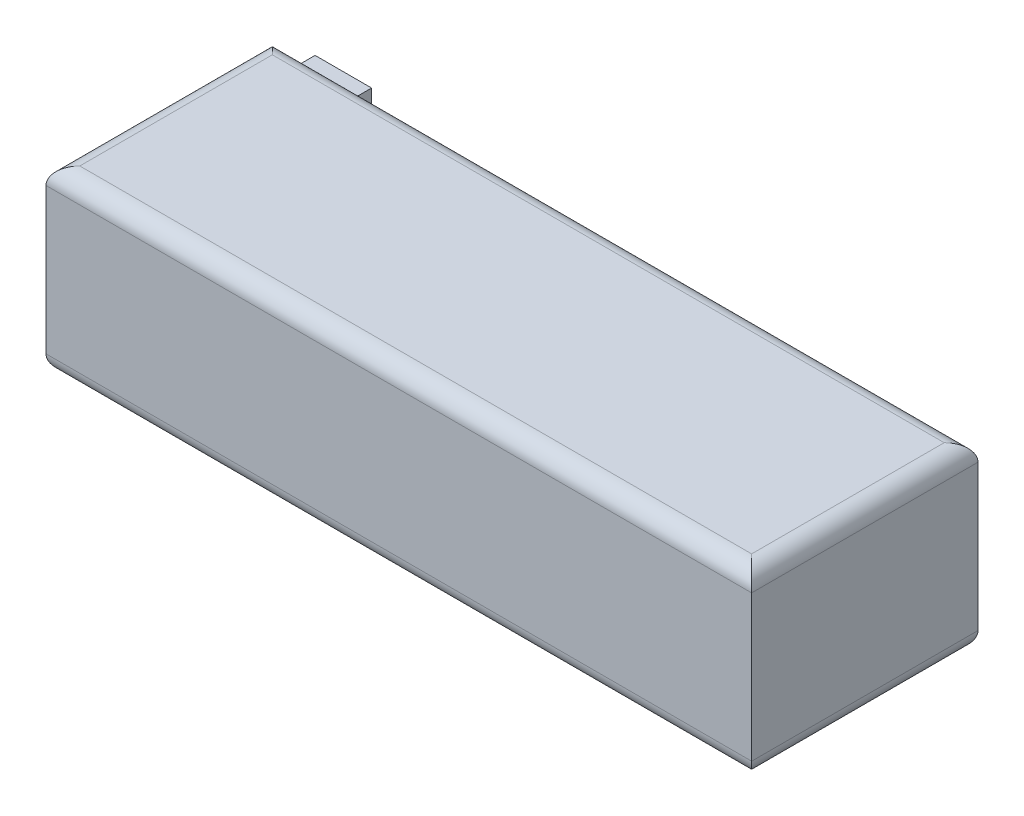
ISO-10303-21;
HEADER;
FILE_DESCRIPTION(('STEP AP214'),'2;1');
FILE_NAME('part.step','',(''),(''),'','','');
FILE_SCHEMA(('AUTOMOTIVE_DESIGN { 1 0 10303 214 1 1 1 1 }'));
ENDSEC;
DATA;
#1=APPLICATION_CONTEXT('core data for automotive mechanical design processes');
#2=APPLICATION_PROTOCOL_DEFINITION('international standard','automotive_design',2000,#1);
#3=PRODUCT_CONTEXT('',#1,'mechanical');
#4=PRODUCT('Part','Part','',(#3));
#5=PRODUCT_RELATED_PRODUCT_CATEGORY('part','',(#4));
#6=PRODUCT_DEFINITION_FORMATION('','',#4);
#7=PRODUCT_DEFINITION_CONTEXT('part definition',#1,'design');
#8=PRODUCT_DEFINITION('design','',#6,#7);
#9=PRODUCT_DEFINITION_SHAPE('','',#8);
#10=(LENGTH_UNIT() NAMED_UNIT(*) SI_UNIT(.MILLI.,.METRE.));
#11=(NAMED_UNIT(*) PLANE_ANGLE_UNIT() SI_UNIT($,.RADIAN.));
#12=(NAMED_UNIT(*) SI_UNIT($,.STERADIAN.) SOLID_ANGLE_UNIT());
#13=UNCERTAINTY_MEASURE_WITH_UNIT(LENGTH_MEASURE(1.E-05),#10,'distance_accuracy_value','');
#14=(GEOMETRIC_REPRESENTATION_CONTEXT(3) GLOBAL_UNCERTAINTY_ASSIGNED_CONTEXT((#13)) GLOBAL_UNIT_ASSIGNED_CONTEXT((#10,
#11,#12)) REPRESENTATION_CONTEXT('',''));
#15=CARTESIAN_POINT('',(0.,0.,0.));
#16=DIRECTION('',(0.,0.,1.));
#17=DIRECTION('',(1.,0.,0.));
#18=AXIS2_PLACEMENT_3D('',#15,#16,#17);
#19=CARTESIAN_POINT('',(-53.05425,13.5001,-17.018));
#20=DIRECTION('',(0.,0.,1.));
#21=DIRECTION('',(1.,0.,0.));
#22=AXIS2_PLACEMENT_3D('',#19,#20,#21);
#23=PLANE('',#22);
#24=DIRECTION('',(0.,-1.,0.));
#25=VECTOR('',#24,1.);
#26=CARTESIAN_POINT('',(-43.71975,5.969,-17.018));
#27=LINE('',#26,#25);
#28=CARTESIAN_POINT('',(-43.71975,-8.509,-17.018));
#29=VERTEX_POINT('',#28);
#30=CARTESIAN_POINT('',(-43.71975,8.509,-17.018));
#31=VERTEX_POINT('',#30);
#32=EDGE_CURVE('E255',#29,#31,#27,.F.);
#33=ORIENTED_EDGE('',*,*,#32,.T.);
#34=DIRECTION('',(1.,0.,0.));
#35=VECTOR('',#34,1.);
#36=CARTESIAN_POINT('',(-53.05425,8.509,-17.018));
#37=LINE('',#36,#35);
#38=CARTESIAN_POINT('',(-53.05425,8.509,-17.018));
#39=VERTEX_POINT('',#38);
#40=EDGE_CURVE('E259',#31,#39,#37,.F.);
#41=ORIENTED_EDGE('',*,*,#40,.T.);
#42=DIRECTION('',(0.,-1.,0.));
#43=VECTOR('',#42,1.);
#44=CARTESIAN_POINT('',(-53.05425,13.5001,-17.018));
#45=LINE('',#44,#43);
#46=CARTESIAN_POINT('',(-53.05425,10.9601,-17.018));
#47=VERTEX_POINT('',#46);
#48=EDGE_CURVE('E192',#47,#39,#45,.T.);
#49=ORIENTED_EDGE('',*,*,#48,.F.);
#50=DIRECTION('',(-1.,0.,0.));
#51=VECTOR('',#50,1.);
#52=CARTESIAN_POINT('',(53.05425,10.9601,-17.018));
#53=LINE('',#52,#51);
#54=CARTESIAN_POINT('',(53.05425,10.9601,-17.018));
#55=VERTEX_POINT('',#54);
#56=EDGE_CURVE('E199',#47,#55,#53,.F.);
#57=ORIENTED_EDGE('',*,*,#56,.T.);
#58=DIRECTION('',(0.,-1.,0.));
#59=VECTOR('',#58,1.);
#60=CARTESIAN_POINT('',(53.05425,13.5001,-17.018));
#61=LINE('',#60,#59);
#62=CARTESIAN_POINT('',(53.05425,-10.9601,-17.018));
#63=VERTEX_POINT('',#62);
#64=EDGE_CURVE('E195',#55,#63,#61,.T.);
#65=ORIENTED_EDGE('',*,*,#64,.T.);
#66=DIRECTION('',(-1.,0.,0.));
#67=VECTOR('',#66,1.);
#68=CARTESIAN_POINT('',(-53.05425,-10.9601,-17.018));
#69=LINE('',#68,#67);
#70=CARTESIAN_POINT('',(-53.05425,-10.9601,-17.018));
#71=VERTEX_POINT('',#70);
#72=EDGE_CURVE('E201',#63,#71,#69,.T.);
#73=ORIENTED_EDGE('',*,*,#72,.T.);
#74=CARTESIAN_POINT('',(-53.05425,-8.509,-17.018));
#75=VERTEX_POINT('',#74);
#76=EDGE_CURVE('E191',#75,#71,#45,.T.);
#77=ORIENTED_EDGE('',*,*,#76,.F.);
#78=DIRECTION('',(-1.,0.,0.));
#79=VECTOR('',#78,1.);
#80=CARTESIAN_POINT('',(-46.25975,-8.509,-17.018));
#81=LINE('',#80,#79);
#82=EDGE_CURVE('E257',#75,#29,#81,.F.);
#83=ORIENTED_EDGE('',*,*,#82,.T.);
#84=EDGE_LOOP('',(#33,#41,#49,#57,#65,#73,#77,#83));
#85=FACE_BOUND('',#84,.T.);
#86=ADVANCED_FACE('F37',(#85),#23,.F.);
#87=CARTESIAN_POINT('',(53.05425,13.5001,-17.018));
#88=DIRECTION('',(-1.,0.,0.));
#89=DIRECTION('',(0.,0.,1.));
#90=AXIS2_PLACEMENT_3D('',#87,#88,#89);
#91=PLANE('',#90);
#92=DIRECTION('',(0.,-1.,0.));
#93=VECTOR('',#92,1.);
#94=CARTESIAN_POINT('',(53.05425,13.5001,17.018));
#95=LINE('',#94,#93);
#96=CARTESIAN_POINT('',(53.05425,10.9601,17.018));
#97=VERTEX_POINT('',#96);
#98=CARTESIAN_POINT('',(53.05425,-10.9601,17.018));
#99=VERTEX_POINT('',#98);
#100=EDGE_CURVE('E184',#97,#99,#95,.T.);
#101=ORIENTED_EDGE('',*,*,#100,.T.);
#102=DIRECTION('',(0.,0.,-1.));
#103=VECTOR('',#102,1.);
#104=CARTESIAN_POINT('',(53.05425,-10.9601,-17.018));
#105=LINE('',#104,#103);
#106=EDGE_CURVE('E224',#99,#63,#105,.T.);
#107=ORIENTED_EDGE('',*,*,#106,.T.);
#108=ORIENTED_EDGE('',*,*,#64,.F.);
#109=DIRECTION('',(0.,0.,-1.));
#110=VECTOR('',#109,1.);
#111=CARTESIAN_POINT('',(53.05425,10.9601,17.018));
#112=LINE('',#111,#110);
#113=EDGE_CURVE('E222',#55,#97,#112,.F.);
#114=ORIENTED_EDGE('',*,*,#113,.T.);
#115=EDGE_LOOP('',(#101,#107,#108,#114));
#116=FACE_BOUND('',#115,.T.);
#117=ADVANCED_FACE('F327',(#116),#91,.F.);
#118=CARTESIAN_POINT('',(-53.05425,13.5001,-17.018));
#119=DIRECTION('',(1.,0.,0.));
#120=DIRECTION('',(0.,0.,-1.));
#121=AXIS2_PLACEMENT_3D('',#118,#119,#120);
#122=PLANE('',#121);
#123=ORIENTED_EDGE('',*,*,#48,.T.);
#124=CARTESIAN_POINT('',(-53.05425,8.509,-19.558));
#125=DIRECTION('',(1.,0.,0.));
#126=DIRECTION('',(0.,0.,-1.));
#127=AXIS2_PLACEMENT_3D('',#124,#125,#126);
#128=CIRCLE('',#127,2.54);
#129=CARTESIAN_POINT('',(-53.05425,5.969,-19.558));
#130=VERTEX_POINT('',#129);
#131=EDGE_CURVE('E46',#39,#130,#128,.T.);
#132=ORIENTED_EDGE('',*,*,#131,.T.);
#133=DIRECTION('',(0.,0.,-1.));
#134=VECTOR('',#133,1.);
#135=CARTESIAN_POINT('',(-53.05425,5.969,-17.018));
#136=LINE('',#135,#134);
#137=CARTESIAN_POINT('',(-53.05425,5.969,-17.018));
#138=VERTEX_POINT('',#137);
#139=EDGE_CURVE('E54',#138,#130,#136,.T.);
#140=ORIENTED_EDGE('',*,*,#139,.F.);
#141=CARTESIAN_POINT('',(-53.05425,-5.969,-17.018));
#142=VERTEX_POINT('',#141);
#143=EDGE_CURVE('E196',#138,#142,#45,.T.);
#144=ORIENTED_EDGE('',*,*,#143,.T.);
#145=DIRECTION('',(0.,0.,1.));
#146=VECTOR('',#145,1.);
#147=CARTESIAN_POINT('',(-53.05425,-5.969,-17.018));
#148=LINE('',#147,#146);
#149=CARTESIAN_POINT('',(-53.05425,-5.969,-19.558));
#150=VERTEX_POINT('',#149);
#151=EDGE_CURVE('E59',#150,#142,#148,.T.);
#152=ORIENTED_EDGE('',*,*,#151,.F.);
#153=CARTESIAN_POINT('',(-53.05425,-8.509,-19.558));
#154=DIRECTION('',(1.,0.,0.));
#155=DIRECTION('',(0.,0.,-1.));
#156=AXIS2_PLACEMENT_3D('',#153,#154,#155);
#157=CIRCLE('',#156,2.54);
#158=EDGE_CURVE('E11',#150,#75,#157,.T.);
#159=ORIENTED_EDGE('',*,*,#158,.T.);
#160=ORIENTED_EDGE('',*,*,#76,.T.);
#161=DIRECTION('',(0.,0.,1.));
#162=VECTOR('',#161,1.);
#163=CARTESIAN_POINT('',(-53.05425,-10.9601,-17.018));
#164=LINE('',#163,#162);
#165=CARTESIAN_POINT('',(-53.05425,-10.9601,17.018));
#166=VERTEX_POINT('',#165);
#167=EDGE_CURVE('E215',#71,#166,#164,.T.);
#168=ORIENTED_EDGE('',*,*,#167,.T.);
#169=DIRECTION('',(0.,-1.,0.));
#170=VECTOR('',#169,1.);
#171=CARTESIAN_POINT('',(-53.05425,13.5001,17.018));
#172=LINE('',#171,#170);
#173=CARTESIAN_POINT('',(-53.05425,10.9601,17.018));
#174=VERTEX_POINT('',#173);
#175=EDGE_CURVE('E187',#174,#166,#172,.T.);
#176=ORIENTED_EDGE('',*,*,#175,.F.);
#177=DIRECTION('',(0.,0.,1.));
#178=VECTOR('',#177,1.);
#179=CARTESIAN_POINT('',(-53.05425,10.9601,-17.018));
#180=LINE('',#179,#178);
#181=EDGE_CURVE('E213',#174,#47,#180,.F.);
#182=ORIENTED_EDGE('',*,*,#181,.T.);
#183=EDGE_LOOP('',(#123,#132,#140,#144,#152,#159,#160,#168,#176,#182));
#184=FACE_BOUND('',#183,.T.);
#185=ADVANCED_FACE('F294',(#184),#122,.F.);
#186=CARTESIAN_POINT('',(-53.05425,13.5001,17.018));
#187=DIRECTION('',(0.,0.,-1.));
#188=DIRECTION('',(-1.,0.,0.));
#189=AXIS2_PLACEMENT_3D('',#186,#187,#188);
#190=PLANE('',#189);
#191=ORIENTED_EDGE('',*,*,#175,.T.);
#192=DIRECTION('',(1.,0.,0.));
#193=VECTOR('',#192,1.);
#194=CARTESIAN_POINT('',(-53.05425,-10.9601,17.018));
#195=LINE('',#194,#193);
#196=EDGE_CURVE('E220',#166,#99,#195,.T.);
#197=ORIENTED_EDGE('',*,*,#196,.T.);
#198=ORIENTED_EDGE('',*,*,#100,.F.);
#199=DIRECTION('',(1.,0.,0.));
#200=VECTOR('',#199,1.);
#201=CARTESIAN_POINT('',(-53.05425,10.9601,17.018));
#202=LINE('',#201,#200);
#203=EDGE_CURVE('E217',#97,#174,#202,.F.);
#204=ORIENTED_EDGE('',*,*,#203,.T.);
#205=EDGE_LOOP('',(#191,#197,#198,#204));
#206=FACE_BOUND('',#205,.T.);
#207=ADVANCED_FACE('F331',(#206),#190,.F.);
#208=CARTESIAN_POINT('',(0.,13.5001,0.));
#209=DIRECTION('',(0.,1.,0.));
#210=DIRECTION('',(0.,0.,1.));
#211=AXIS2_PLACEMENT_3D('',#208,#209,#210);
#212=PLANE('',#211);
#213=DIRECTION('',(0.,0.,1.));
#214=VECTOR('',#213,1.);
#215=CARTESIAN_POINT('',(-50.51425,13.5001,17.018));
#216=LINE('',#215,#214);
#217=CARTESIAN_POINT('',(-50.51425,13.5001,-14.478));
#218=VERTEX_POINT('',#217);
#219=CARTESIAN_POINT('',(-50.51425,13.5001,14.478));
#220=VERTEX_POINT('',#219);
#221=EDGE_CURVE('E230',#218,#220,#216,.T.);
#222=ORIENTED_EDGE('',*,*,#221,.T.);
#223=DIRECTION('',(1.,0.,0.));
#224=VECTOR('',#223,1.);
#225=CARTESIAN_POINT('',(53.05425,13.5001,14.478));
#226=LINE('',#225,#224);
#227=CARTESIAN_POINT('',(50.51425,13.5001,14.478));
#228=VERTEX_POINT('',#227);
#229=EDGE_CURVE('E232',#220,#228,#226,.T.);
#230=ORIENTED_EDGE('',*,*,#229,.T.);
#231=DIRECTION('',(0.,0.,-1.));
#232=VECTOR('',#231,1.);
#233=CARTESIAN_POINT('',(50.51425,13.5001,-17.018));
#234=LINE('',#233,#232);
#235=CARTESIAN_POINT('',(50.51425,13.5001,-14.478));
#236=VERTEX_POINT('',#235);
#237=EDGE_CURVE('E226',#228,#236,#234,.T.);
#238=ORIENTED_EDGE('',*,*,#237,.T.);
#239=DIRECTION('',(-1.,0.,0.));
#240=VECTOR('',#239,1.);
#241=CARTESIAN_POINT('',(-53.05425,13.5001,-14.478));
#242=LINE('',#241,#240);
#243=EDGE_CURVE('E228',#236,#218,#242,.T.);
#244=ORIENTED_EDGE('',*,*,#243,.T.);
#245=EDGE_LOOP('',(#222,#230,#238,#244));
#246=FACE_BOUND('',#245,.T.);
#247=ADVANCED_FACE('F320',(#246),#212,.T.);
#248=CARTESIAN_POINT('',(0.,-13.5001,0.));
#249=DIRECTION('',(0.,1.,0.));
#250=DIRECTION('',(0.,0.,1.));
#251=AXIS2_PLACEMENT_3D('',#248,#249,#250);
#252=PLANE('',#251);
#253=DIRECTION('',(0.,0.,1.));
#254=VECTOR('',#253,1.);
#255=CARTESIAN_POINT('',(-50.51425,-13.5001,0.));
#256=LINE('',#255,#254);
#257=CARTESIAN_POINT('',(-50.51425,-13.5001,14.478));
#258=VERTEX_POINT('',#257);
#259=CARTESIAN_POINT('',(-50.51425,-13.5001,-14.478));
#260=VERTEX_POINT('',#259);
#261=EDGE_CURVE('E208',#258,#260,#256,.F.);
#262=ORIENTED_EDGE('',*,*,#261,.T.);
#263=DIRECTION('',(-1.,0.,0.));
#264=VECTOR('',#263,1.);
#265=CARTESIAN_POINT('',(0.,-13.5001,-14.478));
#266=LINE('',#265,#264);
#267=CARTESIAN_POINT('',(50.51425,-13.5001,-14.478));
#268=VERTEX_POINT('',#267);
#269=EDGE_CURVE('E210',#260,#268,#266,.F.);
#270=ORIENTED_EDGE('',*,*,#269,.T.);
#271=DIRECTION('',(0.,0.,-1.));
#272=VECTOR('',#271,1.);
#273=CARTESIAN_POINT('',(50.51425,-13.5001,0.));
#274=LINE('',#273,#272);
#275=CARTESIAN_POINT('',(50.51425,-13.5001,14.478));
#276=VERTEX_POINT('',#275);
#277=EDGE_CURVE('E204',#268,#276,#274,.F.);
#278=ORIENTED_EDGE('',*,*,#277,.T.);
#279=DIRECTION('',(1.,0.,0.));
#280=VECTOR('',#279,1.);
#281=CARTESIAN_POINT('',(0.,-13.5001,14.478));
#282=LINE('',#281,#280);
#283=EDGE_CURVE('E206',#276,#258,#282,.F.);
#284=ORIENTED_EDGE('',*,*,#283,.T.);
#285=EDGE_LOOP('',(#262,#270,#278,#284));
#286=FACE_BOUND('',#285,.T.);
#287=ADVANCED_FACE('F366',(#286),#252,.F.);
#288=CARTESIAN_POINT('',(-53.05425,-10.9601,14.478));
#289=DIRECTION('',(1.,0.,0.));
#290=DIRECTION('',(0.,0.,-1.));
#291=AXIS2_PLACEMENT_3D('',#288,#289,#290);
#292=CYLINDRICAL_SURFACE('',#291,2.54);
#293=CARTESIAN_POINT('',(-50.51425,-10.9601,14.478));
#294=DIRECTION('',(0.707106781186547,0.,0.707106781186547));
#295=DIRECTION('',(0.707106781186547,0.,-0.707106781186547));
#296=AXIS2_PLACEMENT_3D('',#293,#294,#295);
#297=ELLIPSE('',#296,3.59210244842766,2.54);
#298=EDGE_CURVE('E241',#258,#166,#297,.F.);
#299=ORIENTED_EDGE('',*,*,#298,.F.);
#300=ORIENTED_EDGE('',*,*,#283,.F.);
#301=CARTESIAN_POINT('',(50.51425,-10.9601,14.478));
#302=DIRECTION('',(0.707106781186547,0.,-0.707106781186548));
#303=DIRECTION('',(-0.707106781186548,0.,-0.707106781186547));
#304=AXIS2_PLACEMENT_3D('',#301,#302,#303);
#305=ELLIPSE('',#304,3.59210244842766,2.54);
#306=EDGE_CURVE('E188',#99,#276,#305,.T.);
#307=ORIENTED_EDGE('',*,*,#306,.F.);
#308=ORIENTED_EDGE('',*,*,#196,.F.);
#309=EDGE_LOOP('',(#299,#300,#307,#308));
#310=FACE_BOUND('',#309,.T.);
#311=ADVANCED_FACE('F363',(#310),#292,.T.);
#312=CARTESIAN_POINT('',(50.51425,-10.9601,-17.018));
#313=DIRECTION('',(0.,0.,-1.));
#314=DIRECTION('',(-1.,0.,0.));
#315=AXIS2_PLACEMENT_3D('',#312,#313,#314);
#316=CYLINDRICAL_SURFACE('',#315,2.54);
#317=ORIENTED_EDGE('',*,*,#306,.T.);
#318=ORIENTED_EDGE('',*,*,#277,.F.);
#319=CARTESIAN_POINT('',(50.51425,-10.9601,-14.478));
#320=DIRECTION('',(-0.707106781186548,0.,-0.707106781186547));
#321=DIRECTION('',(0.707106781186547,0.,-0.707106781186548));
#322=AXIS2_PLACEMENT_3D('',#319,#320,#321);
#323=ELLIPSE('',#322,3.59210244842766,2.54);
#324=EDGE_CURVE('E238',#63,#268,#323,.T.);
#325=ORIENTED_EDGE('',*,*,#324,.F.);
#326=ORIENTED_EDGE('',*,*,#106,.F.);
#327=EDGE_LOOP('',(#317,#318,#325,#326));
#328=FACE_BOUND('',#327,.T.);
#329=ADVANCED_FACE('F360',(#328),#316,.T.);
#330=CARTESIAN_POINT('',(-50.51425,-10.9601,-17.018));
#331=DIRECTION('',(0.,0.,1.));
#332=DIRECTION('',(1.,0.,0.));
#333=AXIS2_PLACEMENT_3D('',#330,#331,#332);
#334=CYLINDRICAL_SURFACE('',#333,2.54);
#335=ORIENTED_EDGE('',*,*,#298,.T.);
#336=ORIENTED_EDGE('',*,*,#167,.F.);
#337=CARTESIAN_POINT('',(-50.51425,-10.9601,-14.478));
#338=DIRECTION('',(-0.707106781186547,0.,0.707106781186547));
#339=DIRECTION('',(0.707106781186547,0.,0.707106781186547));
#340=AXIS2_PLACEMENT_3D('',#337,#338,#339);
#341=ELLIPSE('',#340,3.59210244842766,2.54);
#342=EDGE_CURVE('E235',#260,#71,#341,.F.);
#343=ORIENTED_EDGE('',*,*,#342,.F.);
#344=ORIENTED_EDGE('',*,*,#261,.F.);
#345=EDGE_LOOP('',(#335,#336,#343,#344));
#346=FACE_BOUND('',#345,.T.);
#347=ADVANCED_FACE('F356',(#346),#334,.T.);
#348=CARTESIAN_POINT('',(-53.05425,-10.9601,-14.478));
#349=DIRECTION('',(-1.,0.,0.));
#350=DIRECTION('',(0.,0.,1.));
#351=AXIS2_PLACEMENT_3D('',#348,#349,#350);
#352=CYLINDRICAL_SURFACE('',#351,2.54);
#353=ORIENTED_EDGE('',*,*,#324,.T.);
#354=ORIENTED_EDGE('',*,*,#269,.F.);
#355=ORIENTED_EDGE('',*,*,#342,.T.);
#356=ORIENTED_EDGE('',*,*,#72,.F.);
#357=EDGE_LOOP('',(#353,#354,#355,#356));
#358=FACE_BOUND('',#357,.T.);
#359=ADVANCED_FACE('F353',(#358),#352,.T.);
#360=CARTESIAN_POINT('',(0.,10.9601,-14.478));
#361=DIRECTION('',(1.,0.,0.));
#362=DIRECTION('',(0.,0.,-1.));
#363=AXIS2_PLACEMENT_3D('',#360,#361,#362);
#364=CYLINDRICAL_SURFACE('',#363,2.54);
#365=CARTESIAN_POINT('',(50.51425,10.9601,-14.478));
#366=DIRECTION('',(0.707106781186548,0.,0.707106781186547));
#367=DIRECTION('',(-0.707106781186547,0.,0.707106781186548));
#368=AXIS2_PLACEMENT_3D('',#365,#366,#367);
#369=ELLIPSE('',#368,3.59210244842766,2.54);
#370=EDGE_CURVE('E247',#55,#236,#369,.T.);
#371=ORIENTED_EDGE('',*,*,#370,.F.);
#372=ORIENTED_EDGE('',*,*,#56,.F.);
#373=CARTESIAN_POINT('',(-50.51425,10.9601,-14.478));
#374=DIRECTION('',(0.707106781186547,0.,-0.707106781186547));
#375=DIRECTION('',(0.707106781186547,0.,0.707106781186547));
#376=AXIS2_PLACEMENT_3D('',#373,#374,#375);
#377=ELLIPSE('',#376,3.59210244842766,2.54);
#378=EDGE_CURVE('E239',#218,#47,#377,.F.);
#379=ORIENTED_EDGE('',*,*,#378,.F.);
#380=ORIENTED_EDGE('',*,*,#243,.F.);
#381=EDGE_LOOP('',(#371,#372,#379,#380));
#382=FACE_BOUND('',#381,.T.);
#383=ADVANCED_FACE('F311',(#382),#364,.T.);
#384=CARTESIAN_POINT('',(-50.51425,10.9601,0.));
#385=DIRECTION('',(0.,0.,-1.));
#386=DIRECTION('',(-1.,0.,0.));
#387=AXIS2_PLACEMENT_3D('',#384,#385,#386);
#388=CYLINDRICAL_SURFACE('',#387,2.54);
#389=ORIENTED_EDGE('',*,*,#378,.T.);
#390=ORIENTED_EDGE('',*,*,#181,.F.);
#391=CARTESIAN_POINT('',(-50.51425,10.9601,14.478));
#392=DIRECTION('',(-0.707106781186547,0.,-0.707106781186547));
#393=DIRECTION('',(0.707106781186547,0.,-0.707106781186547));
#394=AXIS2_PLACEMENT_3D('',#391,#392,#393);
#395=ELLIPSE('',#394,3.59210244842766,2.54);
#396=EDGE_CURVE('E178',#220,#174,#395,.F.);
#397=ORIENTED_EDGE('',*,*,#396,.F.);
#398=ORIENTED_EDGE('',*,*,#221,.F.);
#399=EDGE_LOOP('',(#389,#390,#397,#398));
#400=FACE_BOUND('',#399,.T.);
#401=ADVANCED_FACE('F316',(#400),#388,.T.);
#402=CARTESIAN_POINT('',(50.51425,10.9601,0.));
#403=DIRECTION('',(0.,0.,1.));
#404=DIRECTION('',(1.,0.,0.));
#405=AXIS2_PLACEMENT_3D('',#402,#403,#404);
#406=CYLINDRICAL_SURFACE('',#405,2.54);
#407=ORIENTED_EDGE('',*,*,#370,.T.);
#408=ORIENTED_EDGE('',*,*,#237,.F.);
#409=CARTESIAN_POINT('',(50.51425,10.9601,14.478));
#410=DIRECTION('',(-0.707106781186547,0.,0.707106781186548));
#411=DIRECTION('',(0.707106781186548,0.,0.707106781186547));
#412=AXIS2_PLACEMENT_3D('',#409,#410,#411);
#413=ELLIPSE('',#412,3.59210244842766,2.54);
#414=EDGE_CURVE('E176',#97,#228,#413,.T.);
#415=ORIENTED_EDGE('',*,*,#414,.F.);
#416=ORIENTED_EDGE('',*,*,#113,.F.);
#417=EDGE_LOOP('',(#407,#408,#415,#416));
#418=FACE_BOUND('',#417,.T.);
#419=ADVANCED_FACE('F323',(#418),#406,.T.);
#420=CARTESIAN_POINT('',(0.,10.9601,14.478));
#421=DIRECTION('',(-1.,0.,0.));
#422=DIRECTION('',(0.,0.,1.));
#423=AXIS2_PLACEMENT_3D('',#420,#421,#422);
#424=CYLINDRICAL_SURFACE('',#423,2.54);
#425=ORIENTED_EDGE('',*,*,#396,.T.);
#426=ORIENTED_EDGE('',*,*,#203,.F.);
#427=ORIENTED_EDGE('',*,*,#414,.T.);
#428=ORIENTED_EDGE('',*,*,#229,.F.);
#429=EDGE_LOOP('',(#425,#426,#427,#428));
#430=FACE_BOUND('',#429,.T.);
#431=ADVANCED_FACE('F334',(#430),#424,.T.);
#432=CARTESIAN_POINT('',(0.,0.,-17.018));
#433=DIRECTION('',(0.,0.,-1.));
#434=DIRECTION('',(-1.,0.,0.));
#435=AXIS2_PLACEMENT_3D('',#432,#433,#434);
#436=PLANE('',#435);
#437=DIRECTION('',(-1.,0.,0.));
#438=VECTOR('',#437,1.);
#439=CARTESIAN_POINT('',(-54.75605,-5.969,-17.018));
#440=LINE('',#439,#438);
#441=CARTESIAN_POINT('',(-54.75605,-5.969,-17.018));
#442=VERTEX_POINT('',#441);
#443=EDGE_CURVE('E171',#142,#442,#440,.T.);
#444=ORIENTED_EDGE('',*,*,#443,.F.);
#445=ORIENTED_EDGE('',*,*,#143,.F.);
#446=DIRECTION('',(1.,0.,0.));
#447=VECTOR('',#446,1.);
#448=CARTESIAN_POINT('',(-54.75605,5.969,-17.018));
#449=LINE('',#448,#447);
#450=CARTESIAN_POINT('',(-54.75605,5.969,-17.018));
#451=VERTEX_POINT('',#450);
#452=EDGE_CURVE('E276',#451,#138,#449,.T.);
#453=ORIENTED_EDGE('',*,*,#452,.F.);
#454=DIRECTION('',(0.,1.,0.));
#455=VECTOR('',#454,1.);
#456=CARTESIAN_POINT('',(-54.75605,-5.969,-17.018));
#457=LINE('',#456,#455);
#458=EDGE_CURVE('E175',#442,#451,#457,.T.);
#459=ORIENTED_EDGE('',*,*,#458,.F.);
#460=EDGE_LOOP('',(#444,#445,#453,#459));
#461=FACE_BOUND('',#460,.T.);
#462=ADVANCED_FACE('F300',(#461),#436,.F.);
#463=CARTESIAN_POINT('',(-54.75605,-5.969,-25.146));
#464=DIRECTION('',(1.,0.,0.));
#465=DIRECTION('',(0.,0.,-1.));
#466=AXIS2_PLACEMENT_3D('',#463,#464,#465);
#467=PLANE('',#466);
#468=ORIENTED_EDGE('',*,*,#458,.T.);
#469=DIRECTION('',(0.,0.,1.));
#470=VECTOR('',#469,1.);
#471=CARTESIAN_POINT('',(-54.75605,5.969,-25.146));
#472=LINE('',#471,#470);
#473=CARTESIAN_POINT('',(-54.75605,5.969,-25.146));
#474=VERTEX_POINT('',#473);
#475=EDGE_CURVE('E154',#474,#451,#472,.T.);
#476=ORIENTED_EDGE('',*,*,#475,.F.);
#477=DIRECTION('',(0.,1.,0.));
#478=VECTOR('',#477,1.);
#479=CARTESIAN_POINT('',(-54.75605,-5.969,-25.146));
#480=LINE('',#479,#478);
#481=CARTESIAN_POINT('',(-54.75605,-5.969,-25.146));
#482=VERTEX_POINT('',#481);
#483=EDGE_CURVE('E162',#482,#474,#480,.T.);
#484=ORIENTED_EDGE('',*,*,#483,.F.);
#485=DIRECTION('',(0.,0.,1.));
#486=VECTOR('',#485,1.);
#487=CARTESIAN_POINT('',(-54.75605,-5.969,-25.146));
#488=LINE('',#487,#486);
#489=EDGE_CURVE('E283',#482,#442,#488,.T.);
#490=ORIENTED_EDGE('',*,*,#489,.T.);
#491=EDGE_LOOP('',(#468,#476,#484,#490));
#492=FACE_BOUND('',#491,.T.);
#493=ADVANCED_FACE('F173',(#492),#467,.F.);
#494=CARTESIAN_POINT('',(-54.75605,5.969,-25.146));
#495=DIRECTION('',(0.,-1.,0.));
#496=DIRECTION('',(0.,0.,-1.));
#497=AXIS2_PLACEMENT_3D('',#494,#495,#496);
#498=PLANE('',#497);
#499=ORIENTED_EDGE('',*,*,#139,.T.);
#500=DIRECTION('',(1.,0.,0.));
#501=VECTOR('',#500,1.);
#502=CARTESIAN_POINT('',(-46.25975,5.969,-19.558));
#503=LINE('',#502,#501);
#504=CARTESIAN_POINT('',(-46.25975,5.969,-19.558));
#505=VERTEX_POINT('',#504);
#506=EDGE_CURVE('E253',#130,#505,#503,.T.);
#507=ORIENTED_EDGE('',*,*,#506,.T.);
#508=DIRECTION('',(0.,0.,1.));
#509=VECTOR('',#508,1.);
#510=CARTESIAN_POINT('',(-46.25975,5.969,-25.146));
#511=LINE('',#510,#509);
#512=CARTESIAN_POINT('',(-46.25975,5.969,-25.146));
#513=VERTEX_POINT('',#512);
#514=EDGE_CURVE('E158',#513,#505,#511,.T.);
#515=ORIENTED_EDGE('',*,*,#514,.F.);
#516=DIRECTION('',(1.,0.,0.));
#517=VECTOR('',#516,1.);
#518=CARTESIAN_POINT('',(-54.75605,5.969,-25.146));
#519=LINE('',#518,#517);
#520=EDGE_CURVE('E150',#474,#513,#519,.T.);
#521=ORIENTED_EDGE('',*,*,#520,.F.);
#522=ORIENTED_EDGE('',*,*,#475,.T.);
#523=ORIENTED_EDGE('',*,*,#452,.T.);
#524=EDGE_LOOP('',(#499,#507,#515,#521,#522,#523));
#525=FACE_BOUND('',#524,.T.);
#526=ADVANCED_FACE('F152',(#525),#498,.F.);
#527=CARTESIAN_POINT('',(-46.25975,-5.969,-25.146));
#528=DIRECTION('',(-1.,0.,0.));
#529=DIRECTION('',(0.,0.,1.));
#530=AXIS2_PLACEMENT_3D('',#527,#528,#529);
#531=PLANE('',#530);
#532=ORIENTED_EDGE('',*,*,#514,.T.);
#533=DIRECTION('',(0.,-1.,0.));
#534=VECTOR('',#533,1.);
#535=CARTESIAN_POINT('',(-46.25975,-5.969,-19.558));
#536=LINE('',#535,#534);
#537=CARTESIAN_POINT('',(-46.25975,-5.969,-19.558));
#538=VERTEX_POINT('',#537);
#539=EDGE_CURVE('E264',#505,#538,#536,.T.);
#540=ORIENTED_EDGE('',*,*,#539,.T.);
#541=DIRECTION('',(0.,0.,1.));
#542=VECTOR('',#541,1.);
#543=CARTESIAN_POINT('',(-46.25975,-5.969,-25.146));
#544=LINE('',#543,#542);
#545=CARTESIAN_POINT('',(-46.25975,-5.969,-25.146));
#546=VERTEX_POINT('',#545);
#547=EDGE_CURVE('E180',#546,#538,#544,.T.);
#548=ORIENTED_EDGE('',*,*,#547,.F.);
#549=DIRECTION('',(0.,-1.,0.));
#550=VECTOR('',#549,1.);
#551=CARTESIAN_POINT('',(-46.25975,-5.969,-25.146));
#552=LINE('',#551,#550);
#553=EDGE_CURVE('E161',#513,#546,#552,.T.);
#554=ORIENTED_EDGE('',*,*,#553,.F.);
#555=EDGE_LOOP('',(#532,#540,#548,#554));
#556=FACE_BOUND('',#555,.T.);
#557=ADVANCED_FACE('F518',(#556),#531,.F.);
#558=CARTESIAN_POINT('',(-54.75605,-5.969,-25.146));
#559=DIRECTION('',(0.,1.,0.));
#560=DIRECTION('',(-1.,0.,0.));
#561=AXIS2_PLACEMENT_3D('',#558,#559,#560);
#562=PLANE('',#561);
#563=ORIENTED_EDGE('',*,*,#547,.T.);
#564=DIRECTION('',(-1.,0.,0.));
#565=VECTOR('',#564,1.);
#566=CARTESIAN_POINT('',(-53.05425,-5.969,-19.558));
#567=LINE('',#566,#565);
#568=EDGE_CURVE('E262',#538,#150,#567,.T.);
#569=ORIENTED_EDGE('',*,*,#568,.T.);
#570=ORIENTED_EDGE('',*,*,#151,.T.);
#571=ORIENTED_EDGE('',*,*,#443,.T.);
#572=ORIENTED_EDGE('',*,*,#489,.F.);
#573=DIRECTION('',(-1.,0.,0.));
#574=VECTOR('',#573,1.);
#575=CARTESIAN_POINT('',(-54.75605,-5.969,-25.146));
#576=LINE('',#575,#574);
#577=EDGE_CURVE('E167',#546,#482,#576,.T.);
#578=ORIENTED_EDGE('',*,*,#577,.F.);
#579=EDGE_LOOP('',(#563,#569,#570,#571,#572,#578));
#580=FACE_BOUND('',#579,.T.);
#581=ADVANCED_FACE('F288',(#580),#562,.F.);
#582=CARTESIAN_POINT('',(0.,0.,-25.146));
#583=DIRECTION('',(0.,0.,-1.));
#584=DIRECTION('',(-1.,0.,0.));
#585=AXIS2_PLACEMENT_3D('',#582,#583,#584);
#586=PLANE('',#585);
#587=ORIENTED_EDGE('',*,*,#483,.T.);
#588=ORIENTED_EDGE('',*,*,#520,.T.);
#589=ORIENTED_EDGE('',*,*,#553,.T.);
#590=ORIENTED_EDGE('',*,*,#577,.T.);
#591=EDGE_LOOP('',(#587,#588,#589,#590));
#592=FACE_BOUND('',#591,.T.);
#593=ADVANCED_FACE('F165',(#592),#586,.T.);
#594=CARTESIAN_POINT('',(-54.75605,-8.509,-19.558));
#595=DIRECTION('',(1.,0.,0.));
#596=DIRECTION('',(0.,1.,0.));
#597=AXIS2_PLACEMENT_3D('',#594,#595,#596);
#598=CYLINDRICAL_SURFACE('',#597,2.54);
#599=ORIENTED_EDGE('',*,*,#158,.F.);
#600=ORIENTED_EDGE('',*,*,#568,.F.);
#601=CARTESIAN_POINT('',(-43.71975,-8.509,-19.558));
#602=DIRECTION('',(0.707106781186547,0.707106781186547,0.));
#603=DIRECTION('',(-0.707106781186548,0.707106781186547,0.));
#604=AXIS2_PLACEMENT_3D('',#601,#602,#603);
#605=ELLIPSE('',#604,3.59210244842766,2.54);
#606=EDGE_CURVE('E41',#29,#538,#605,.F.);
#607=ORIENTED_EDGE('',*,*,#606,.F.);
#608=ORIENTED_EDGE('',*,*,#82,.F.);
#609=EDGE_LOOP('',(#599,#600,#607,#608));
#610=FACE_BOUND('',#609,.T.);
#611=ADVANCED_FACE('F39',(#610),#598,.F.);
#612=CARTESIAN_POINT('',(-43.71975,-5.969,-19.558));
#613=DIRECTION('',(0.,1.,0.));
#614=DIRECTION('',(0.,0.,1.));
#615=AXIS2_PLACEMENT_3D('',#612,#613,#614);
#616=CYLINDRICAL_SURFACE('',#615,2.54);
#617=ORIENTED_EDGE('',*,*,#606,.T.);
#618=ORIENTED_EDGE('',*,*,#539,.F.);
#619=CARTESIAN_POINT('',(-43.71975,8.509,-19.558));
#620=DIRECTION('',(-0.707106781186547,0.707106781186547,0.));
#621=DIRECTION('',(0.707106781186547,0.707106781186547,0.));
#622=AXIS2_PLACEMENT_3D('',#619,#620,#621);
#623=ELLIPSE('',#622,3.59210244842766,2.54);
#624=EDGE_CURVE('E266',#31,#505,#623,.F.);
#625=ORIENTED_EDGE('',*,*,#624,.F.);
#626=ORIENTED_EDGE('',*,*,#32,.F.);
#627=EDGE_LOOP('',(#617,#618,#625,#626));
#628=FACE_BOUND('',#627,.T.);
#629=ADVANCED_FACE('F539',(#628),#616,.F.);
#630=CARTESIAN_POINT('',(-54.75605,8.509,-19.558));
#631=DIRECTION('',(-1.,0.,0.));
#632=DIRECTION('',(0.,0.,1.));
#633=AXIS2_PLACEMENT_3D('',#630,#631,#632);
#634=CYLINDRICAL_SURFACE('',#633,2.54);
#635=ORIENTED_EDGE('',*,*,#131,.F.);
#636=ORIENTED_EDGE('',*,*,#40,.F.);
#637=ORIENTED_EDGE('',*,*,#624,.T.);
#638=ORIENTED_EDGE('',*,*,#506,.F.);
#639=EDGE_LOOP('',(#635,#636,#637,#638));
#640=FACE_BOUND('',#639,.T.);
#641=ADVANCED_FACE('F302',(#640),#634,.F.);
#642=CLOSED_SHELL('',(#86,#117,#185,#207,#247,#287,#311,#329,#347,#359,#383,#401,#419,#431,#462,
#493,#526,#557,#581,#593,#611,#629,#641));
#643=MANIFOLD_SOLID_BREP('B2',#642);
#644=ADVANCED_BREP_SHAPE_REPRESENTATION('',(#18,#643),#14);
#645=SHAPE_DEFINITION_REPRESENTATION(#9,#644);
ENDSEC;
END-ISO-10303-21;
